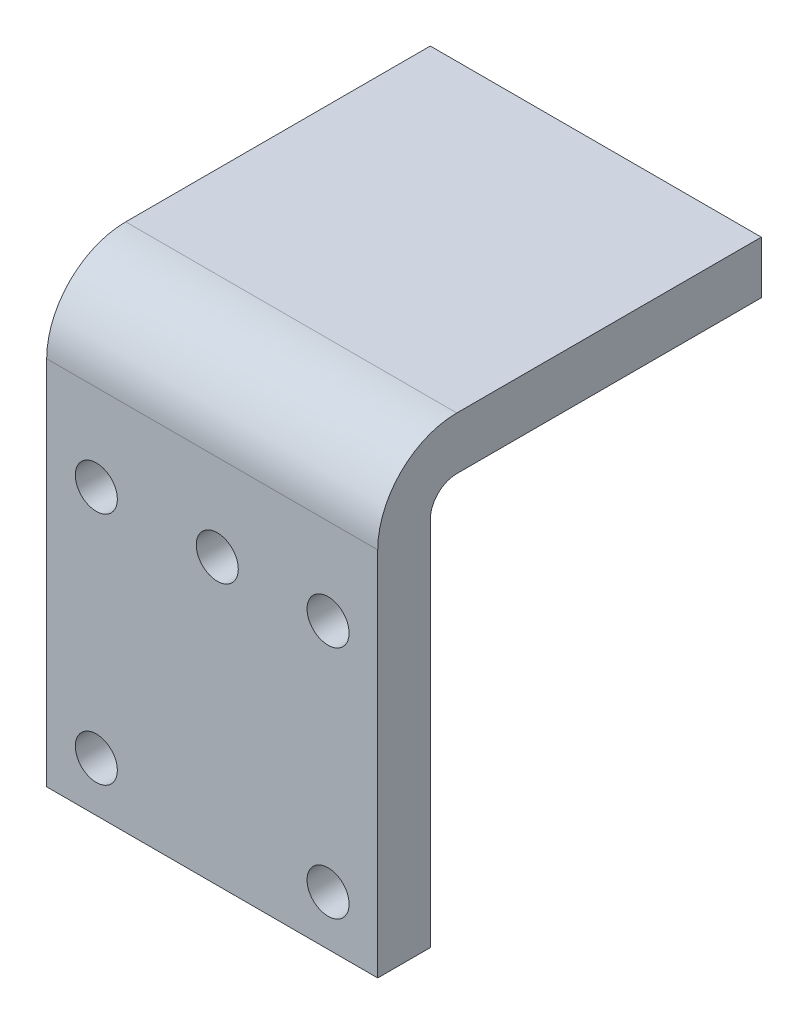
ISO-10303-21;
HEADER;
FILE_DESCRIPTION(('STEP AP214'),'2;1');
FILE_NAME('part.step','',(''),(''),'','','');
FILE_SCHEMA(('AUTOMOTIVE_DESIGN { 1 0 10303 214 1 1 1 1 }'));
ENDSEC;
DATA;
#1=APPLICATION_CONTEXT('core data for automotive mechanical design processes');
#2=APPLICATION_PROTOCOL_DEFINITION('international standard','automotive_design',2000,#1);
#3=PRODUCT_CONTEXT('',#1,'mechanical');
#4=PRODUCT('Part','Part','',(#3));
#5=PRODUCT_RELATED_PRODUCT_CATEGORY('part','',(#4));
#6=PRODUCT_DEFINITION_FORMATION('','',#4);
#7=PRODUCT_DEFINITION_CONTEXT('part definition',#1,'design');
#8=PRODUCT_DEFINITION('design','',#6,#7);
#9=PRODUCT_DEFINITION_SHAPE('','',#8);
#10=(LENGTH_UNIT() NAMED_UNIT(*) SI_UNIT(.MILLI.,.METRE.));
#11=(NAMED_UNIT(*) PLANE_ANGLE_UNIT() SI_UNIT($,.RADIAN.));
#12=(NAMED_UNIT(*) SI_UNIT($,.STERADIAN.) SOLID_ANGLE_UNIT());
#13=UNCERTAINTY_MEASURE_WITH_UNIT(LENGTH_MEASURE(1.E-05),#10,'distance_accuracy_value','');
#14=(GEOMETRIC_REPRESENTATION_CONTEXT(3) GLOBAL_UNCERTAINTY_ASSIGNED_CONTEXT((#13)) GLOBAL_UNIT_ASSIGNED_CONTEXT((#10,
#11,#12)) REPRESENTATION_CONTEXT('',''));
#15=CARTESIAN_POINT('',(0.,0.,0.));
#16=DIRECTION('',(0.,0.,1.));
#17=DIRECTION('',(1.,0.,0.));
#18=AXIS2_PLACEMENT_3D('',#15,#16,#17);
#19=CARTESIAN_POINT('',(100.,0.,-100.));
#20=DIRECTION('',(0.,0.,1.));
#21=DIRECTION('',(1.,0.,0.));
#22=AXIS2_PLACEMENT_3D('',#19,#20,#21);
#23=PLANE('',#22);
#24=DIRECTION('',(0.,1.,0.));
#25=VECTOR('',#24,1.);
#26=CARTESIAN_POINT('',(0.,0.,-100.));
#27=LINE('',#26,#25);
#28=CARTESIAN_POINT('',(0.,0.,-100.));
#29=VERTEX_POINT('',#28);
#30=CARTESIAN_POINT('',(0.,15.875,-100.));
#31=VERTEX_POINT('',#30);
#32=EDGE_CURVE('E132',#29,#31,#27,.T.);
#33=ORIENTED_EDGE('',*,*,#32,.T.);
#34=DIRECTION('',(-1.,0.,0.));
#35=VECTOR('',#34,1.);
#36=CARTESIAN_POINT('',(100.,15.875,-100.));
#37=LINE('',#36,#35);
#38=CARTESIAN_POINT('',(100.,15.875,-100.));
#39=VERTEX_POINT('',#38);
#40=EDGE_CURVE('E11',#39,#31,#37,.T.);
#41=ORIENTED_EDGE('',*,*,#40,.F.);
#42=DIRECTION('',(0.,1.,0.));
#43=VECTOR('',#42,1.);
#44=CARTESIAN_POINT('',(100.,0.,-100.));
#45=LINE('',#44,#43);
#46=CARTESIAN_POINT('',(100.,0.,-100.));
#47=VERTEX_POINT('',#46);
#48=EDGE_CURVE('E147',#47,#39,#45,.T.);
#49=ORIENTED_EDGE('',*,*,#48,.F.);
#50=DIRECTION('',(-1.,0.,0.));
#51=VECTOR('',#50,1.);
#52=CARTESIAN_POINT('',(100.,0.,-100.));
#53=LINE('',#52,#51);
#54=EDGE_CURVE('E128',#47,#29,#53,.T.);
#55=ORIENTED_EDGE('',*,*,#54,.T.);
#56=EDGE_LOOP('',(#33,#41,#49,#55));
#57=FACE_BOUND('',#56,.T.);
#58=ADVANCED_FACE('F34',(#57),#23,.F.);
#59=CARTESIAN_POINT('',(100.,15.875,-8.));
#60=DIRECTION('',(0.,-1.,0.));
#61=DIRECTION('',(0.,0.,-1.));
#62=AXIS2_PLACEMENT_3D('',#59,#60,#61);
#63=PLANE('',#62);
#64=DIRECTION('',(0.,0.,1.));
#65=VECTOR('',#64,1.);
#66=CARTESIAN_POINT('',(0.,15.875,-8.));
#67=LINE('',#66,#65);
#68=CARTESIAN_POINT('',(0.,15.875,-8.));
#69=VERTEX_POINT('',#68);
#70=EDGE_CURVE('E135',#31,#69,#67,.T.);
#71=ORIENTED_EDGE('',*,*,#70,.T.);
#72=DIRECTION('',(-1.,0.,0.));
#73=VECTOR('',#72,1.);
#74=CARTESIAN_POINT('',(100.,15.875,-8.));
#75=LINE('',#74,#73);
#76=CARTESIAN_POINT('',(100.,15.875,-8.));
#77=VERTEX_POINT('',#76);
#78=EDGE_CURVE('E43',#77,#69,#75,.T.);
#79=ORIENTED_EDGE('',*,*,#78,.F.);
#80=DIRECTION('',(0.,0.,1.));
#81=VECTOR('',#80,1.);
#82=CARTESIAN_POINT('',(100.,15.875,-8.));
#83=LINE('',#82,#81);
#84=EDGE_CURVE('E95',#39,#77,#83,.T.);
#85=ORIENTED_EDGE('',*,*,#84,.F.);
#86=ORIENTED_EDGE('',*,*,#40,.T.);
#87=EDGE_LOOP('',(#71,#79,#85,#86));
#88=FACE_BOUND('',#87,.T.);
#89=ADVANCED_FACE('F216',(#88),#63,.F.);
#90=CARTESIAN_POINT('',(100.,-8.,-8.));
#91=DIRECTION('',(-1.,0.,0.));
#92=DIRECTION('',(0.,0.,1.));
#93=AXIS2_PLACEMENT_3D('',#90,#91,#92);
#94=CYLINDRICAL_SURFACE('',#93,23.875);
#95=CARTESIAN_POINT('',(0.,-8.,-8.));
#96=DIRECTION('',(1.,0.,0.));
#97=DIRECTION('',(0.,0.,-1.));
#98=AXIS2_PLACEMENT_3D('',#95,#96,#97);
#99=CIRCLE('',#98,23.875);
#100=CARTESIAN_POINT('',(0.,-8.,15.875));
#101=VERTEX_POINT('',#100);
#102=EDGE_CURVE('E138',#69,#101,#99,.T.);
#103=ORIENTED_EDGE('',*,*,#102,.T.);
#104=DIRECTION('',(-1.,0.,0.));
#105=VECTOR('',#104,1.);
#106=CARTESIAN_POINT('',(100.,-8.,15.875));
#107=LINE('',#106,#105);
#108=CARTESIAN_POINT('',(100.,-8.,15.875));
#109=VERTEX_POINT('',#108);
#110=EDGE_CURVE('E154',#109,#101,#107,.T.);
#111=ORIENTED_EDGE('',*,*,#110,.F.);
#112=CARTESIAN_POINT('',(100.,-8.,-8.));
#113=DIRECTION('',(1.,0.,0.));
#114=DIRECTION('',(0.,0.,-1.));
#115=AXIS2_PLACEMENT_3D('',#112,#113,#114);
#116=CIRCLE('',#115,23.875);
#117=EDGE_CURVE('E185',#77,#109,#116,.T.);
#118=ORIENTED_EDGE('',*,*,#117,.F.);
#119=ORIENTED_EDGE('',*,*,#78,.T.);
#120=EDGE_LOOP('',(#103,#111,#118,#119));
#121=FACE_BOUND('',#120,.T.);
#122=ADVANCED_FACE('F220',(#121),#94,.T.);
#123=CARTESIAN_POINT('',(100.,-8.,15.875));
#124=DIRECTION('',(0.,0.,-1.));
#125=DIRECTION('',(-1.,0.,0.));
#126=AXIS2_PLACEMENT_3D('',#123,#124,#125);
#127=PLANE('',#126);
#128=CARTESIAN_POINT('',(51.5321893870748,-34.0898949094365,15.875));
#129=DIRECTION('',(0.,0.,1.));
#130=DIRECTION('',(1.,0.,0.));
#131=AXIS2_PLACEMENT_3D('',#128,#129,#130);
#132=CIRCLE('',#131,6.35000000000001);
#133=CARTESIAN_POINT('',(57.8821893870748,-34.0898949094365,15.875));
#134=VERTEX_POINT('',#133);
#135=EDGE_CURVE('E271',#134,#134,#132,.T.);
#136=ORIENTED_EDGE('',*,*,#135,.F.);
#137=EDGE_LOOP('',(#136));
#138=FACE_BOUND('',#137,.T.);
#139=CARTESIAN_POINT('',(85.,-105.,15.875));
#140=DIRECTION('',(0.,0.,1.));
#141=DIRECTION('',(1.,0.,0.));
#142=AXIS2_PLACEMENT_3D('',#139,#140,#141);
#143=CIRCLE('',#142,6.34999999999999);
#144=CARTESIAN_POINT('',(91.35,-105.,15.875));
#145=VERTEX_POINT('',#144);
#146=EDGE_CURVE('E269',#145,#145,#143,.T.);
#147=ORIENTED_EDGE('',*,*,#146,.F.);
#148=EDGE_LOOP('',(#147));
#149=FACE_BOUND('',#148,.T.);
#150=CARTESIAN_POINT('',(15.,-105.,15.875));
#151=DIRECTION('',(0.,0.,1.));
#152=DIRECTION('',(1.,0.,0.));
#153=AXIS2_PLACEMENT_3D('',#150,#151,#152);
#154=CIRCLE('',#153,6.35);
#155=CARTESIAN_POINT('',(21.35,-105.,15.875));
#156=VERTEX_POINT('',#155);
#157=EDGE_CURVE('E181',#156,#156,#154,.T.);
#158=ORIENTED_EDGE('',*,*,#157,.F.);
#159=EDGE_LOOP('',(#158));
#160=FACE_BOUND('',#159,.T.);
#161=CARTESIAN_POINT('',(85.,-34.0898949094365,15.875));
#162=DIRECTION('',(0.,0.,1.));
#163=DIRECTION('',(1.,0.,0.));
#164=AXIS2_PLACEMENT_3D('',#161,#162,#163);
#165=CIRCLE('',#164,6.35);
#166=CARTESIAN_POINT('',(91.35,-34.0898949094365,15.875));
#167=VERTEX_POINT('',#166);
#168=EDGE_CURVE('E166',#167,#167,#165,.T.);
#169=ORIENTED_EDGE('',*,*,#168,.F.);
#170=EDGE_LOOP('',(#169));
#171=FACE_BOUND('',#170,.T.);
#172=CARTESIAN_POINT('',(15.,-34.0898949094365,15.875));
#173=DIRECTION('',(0.,0.,1.));
#174=DIRECTION('',(1.,0.,0.));
#175=AXIS2_PLACEMENT_3D('',#172,#173,#174);
#176=CIRCLE('',#175,6.35);
#177=CARTESIAN_POINT('',(21.35,-34.0898949094365,15.875));
#178=VERTEX_POINT('',#177);
#179=EDGE_CURVE('E161',#178,#178,#176,.T.);
#180=ORIENTED_EDGE('',*,*,#179,.F.);
#181=EDGE_LOOP('',(#180));
#182=FACE_BOUND('',#181,.T.);
#183=DIRECTION('',(0.,-1.,0.));
#184=VECTOR('',#183,1.);
#185=CARTESIAN_POINT('',(0.,-8.,15.875));
#186=LINE('',#185,#184);
#187=CARTESIAN_POINT('',(0.,-120.,15.875));
#188=VERTEX_POINT('',#187);
#189=EDGE_CURVE('E140',#101,#188,#186,.T.);
#190=ORIENTED_EDGE('',*,*,#189,.T.);
#191=DIRECTION('',(-1.,0.,0.));
#192=VECTOR('',#191,1.);
#193=CARTESIAN_POINT('',(100.,-120.,15.875));
#194=LINE('',#193,#192);
#195=CARTESIAN_POINT('',(100.,-120.,15.875));
#196=VERTEX_POINT('',#195);
#197=EDGE_CURVE('E151',#196,#188,#194,.T.);
#198=ORIENTED_EDGE('',*,*,#197,.F.);
#199=DIRECTION('',(0.,-1.,0.));
#200=VECTOR('',#199,1.);
#201=CARTESIAN_POINT('',(100.,-8.,15.875));
#202=LINE('',#201,#200);
#203=EDGE_CURVE('E187',#109,#196,#202,.T.);
#204=ORIENTED_EDGE('',*,*,#203,.F.);
#205=ORIENTED_EDGE('',*,*,#110,.T.);
#206=EDGE_LOOP('',(#190,#198,#204,#205));
#207=FACE_BOUND('',#206,.T.);
#208=ADVANCED_FACE('F193',(#138,#149,#160,#171,#182,#207),#127,.F.);
#209=CARTESIAN_POINT('',(100.,-120.,0.));
#210=DIRECTION('',(0.,1.,0.));
#211=DIRECTION('',(0.,0.,1.));
#212=AXIS2_PLACEMENT_3D('',#209,#210,#211);
#213=PLANE('',#212);
#214=DIRECTION('',(0.,0.,-1.));
#215=VECTOR('',#214,1.);
#216=CARTESIAN_POINT('',(0.,-120.,0.));
#217=LINE('',#216,#215);
#218=CARTESIAN_POINT('',(0.,-120.,0.));
#219=VERTEX_POINT('',#218);
#220=EDGE_CURVE('E142',#188,#219,#217,.T.);
#221=ORIENTED_EDGE('',*,*,#220,.T.);
#222=DIRECTION('',(-1.,0.,0.));
#223=VECTOR('',#222,1.);
#224=CARTESIAN_POINT('',(100.,-120.,0.));
#225=LINE('',#224,#223);
#226=CARTESIAN_POINT('',(100.,-120.,0.));
#227=VERTEX_POINT('',#226);
#228=EDGE_CURVE('E123',#227,#219,#225,.T.);
#229=ORIENTED_EDGE('',*,*,#228,.F.);
#230=DIRECTION('',(0.,0.,-1.));
#231=VECTOR('',#230,1.);
#232=CARTESIAN_POINT('',(100.,-120.,0.));
#233=LINE('',#232,#231);
#234=EDGE_CURVE('E114',#196,#227,#233,.T.);
#235=ORIENTED_EDGE('',*,*,#234,.F.);
#236=ORIENTED_EDGE('',*,*,#197,.T.);
#237=EDGE_LOOP('',(#221,#229,#235,#236));
#238=FACE_BOUND('',#237,.T.);
#239=ADVANCED_FACE('F197',(#238),#213,.F.);
#240=CARTESIAN_POINT('',(100.,-8.,0.));
#241=DIRECTION('',(0.,0.,1.));
#242=DIRECTION('',(0.,-1.,0.));
#243=AXIS2_PLACEMENT_3D('',#240,#241,#242);
#244=PLANE('',#243);
#245=CARTESIAN_POINT('',(51.5321893870748,-34.0898949094365,0.));
#246=DIRECTION('',(0.,0.,1.));
#247=DIRECTION('',(0.,-1.,0.));
#248=AXIS2_PLACEMENT_3D('',#245,#246,#247);
#249=CIRCLE('',#248,6.35000000000001);
#250=CARTESIAN_POINT('',(51.5321893870748,-40.4398949094365,0.));
#251=VERTEX_POINT('',#250);
#252=EDGE_CURVE('E37',#251,#251,#249,.T.);
#253=ORIENTED_EDGE('',*,*,#252,.T.);
#254=EDGE_LOOP('',(#253));
#255=FACE_BOUND('',#254,.T.);
#256=CARTESIAN_POINT('',(85.,-105.,0.));
#257=DIRECTION('',(0.,0.,1.));
#258=DIRECTION('',(0.,-1.,0.));
#259=AXIS2_PLACEMENT_3D('',#256,#257,#258);
#260=CIRCLE('',#259,6.34999999999999);
#261=CARTESIAN_POINT('',(85.,-111.35,0.));
#262=VERTEX_POINT('',#261);
#263=EDGE_CURVE('E168',#262,#262,#260,.T.);
#264=ORIENTED_EDGE('',*,*,#263,.T.);
#265=EDGE_LOOP('',(#264));
#266=FACE_BOUND('',#265,.T.);
#267=CARTESIAN_POINT('',(15.,-105.,0.));
#268=DIRECTION('',(0.,0.,1.));
#269=DIRECTION('',(0.,-1.,0.));
#270=AXIS2_PLACEMENT_3D('',#267,#268,#269);
#271=CIRCLE('',#270,6.35);
#272=CARTESIAN_POINT('',(15.,-111.35,0.));
#273=VERTEX_POINT('',#272);
#274=EDGE_CURVE('E165',#273,#273,#271,.T.);
#275=ORIENTED_EDGE('',*,*,#274,.T.);
#276=EDGE_LOOP('',(#275));
#277=FACE_BOUND('',#276,.T.);
#278=CARTESIAN_POINT('',(85.,-34.0898949094365,0.));
#279=DIRECTION('',(0.,0.,1.));
#280=DIRECTION('',(0.,-1.,0.));
#281=AXIS2_PLACEMENT_3D('',#278,#279,#280);
#282=CIRCLE('',#281,6.35);
#283=CARTESIAN_POINT('',(85.,-40.4398949094365,0.));
#284=VERTEX_POINT('',#283);
#285=EDGE_CURVE('E162',#284,#284,#282,.T.);
#286=ORIENTED_EDGE('',*,*,#285,.T.);
#287=EDGE_LOOP('',(#286));
#288=FACE_BOUND('',#287,.T.);
#289=CARTESIAN_POINT('',(15.,-34.0898949094365,0.));
#290=DIRECTION('',(0.,0.,1.));
#291=DIRECTION('',(0.,-1.,0.));
#292=AXIS2_PLACEMENT_3D('',#289,#290,#291);
#293=CIRCLE('',#292,6.35);
#294=CARTESIAN_POINT('',(15.,-40.4398949094365,0.));
#295=VERTEX_POINT('',#294);
#296=EDGE_CURVE('E136',#295,#295,#293,.T.);
#297=ORIENTED_EDGE('',*,*,#296,.T.);
#298=EDGE_LOOP('',(#297));
#299=FACE_BOUND('',#298,.T.);
#300=DIRECTION('',(0.,1.,0.));
#301=VECTOR('',#300,1.);
#302=CARTESIAN_POINT('',(0.,-8.,0.));
#303=LINE('',#302,#301);
#304=CARTESIAN_POINT('',(0.,-8.,0.));
#305=VERTEX_POINT('',#304);
#306=EDGE_CURVE('E122',#219,#305,#303,.T.);
#307=ORIENTED_EDGE('',*,*,#306,.T.);
#308=DIRECTION('',(-1.,0.,0.));
#309=VECTOR('',#308,1.);
#310=CARTESIAN_POINT('',(100.,-8.,0.));
#311=LINE('',#310,#309);
#312=CARTESIAN_POINT('',(100.,-8.,0.));
#313=VERTEX_POINT('',#312);
#314=EDGE_CURVE('E119',#313,#305,#311,.T.);
#315=ORIENTED_EDGE('',*,*,#314,.F.);
#316=DIRECTION('',(0.,1.,0.));
#317=VECTOR('',#316,1.);
#318=CARTESIAN_POINT('',(100.,-8.,0.));
#319=LINE('',#318,#317);
#320=EDGE_CURVE('E108',#227,#313,#319,.T.);
#321=ORIENTED_EDGE('',*,*,#320,.F.);
#322=ORIENTED_EDGE('',*,*,#228,.T.);
#323=EDGE_LOOP('',(#307,#315,#321,#322));
#324=FACE_BOUND('',#323,.T.);
#325=ADVANCED_FACE('F120',(#255,#266,#277,#288,#299,#324),#244,.F.);
#326=CARTESIAN_POINT('',(100.,-8.,-8.));
#327=DIRECTION('',(-1.,0.,0.));
#328=DIRECTION('',(0.,0.,1.));
#329=AXIS2_PLACEMENT_3D('',#326,#327,#328);
#330=CYLINDRICAL_SURFACE('',#329,8.);
#331=CARTESIAN_POINT('',(0.,-8.,-8.));
#332=DIRECTION('',(-1.,0.,0.));
#333=DIRECTION('',(0.,0.,-1.));
#334=AXIS2_PLACEMENT_3D('',#331,#332,#333);
#335=CIRCLE('',#334,8.);
#336=CARTESIAN_POINT('',(0.,0.,-8.));
#337=VERTEX_POINT('',#336);
#338=EDGE_CURVE('E81',#305,#337,#335,.T.);
#339=ORIENTED_EDGE('',*,*,#338,.T.);
#340=DIRECTION('',(-1.,0.,0.));
#341=VECTOR('',#340,1.);
#342=CARTESIAN_POINT('',(100.,0.,-8.));
#343=LINE('',#342,#341);
#344=CARTESIAN_POINT('',(100.,0.,-8.));
#345=VERTEX_POINT('',#344);
#346=EDGE_CURVE('E124',#345,#337,#343,.T.);
#347=ORIENTED_EDGE('',*,*,#346,.F.);
#348=CARTESIAN_POINT('',(100.,-8.,-8.));
#349=DIRECTION('',(-1.,0.,0.));
#350=DIRECTION('',(0.,0.,-1.));
#351=AXIS2_PLACEMENT_3D('',#348,#349,#350);
#352=CIRCLE('',#351,8.);
#353=EDGE_CURVE('E112',#313,#345,#352,.T.);
#354=ORIENTED_EDGE('',*,*,#353,.F.);
#355=ORIENTED_EDGE('',*,*,#314,.T.);
#356=EDGE_LOOP('',(#339,#347,#354,#355));
#357=FACE_BOUND('',#356,.T.);
#358=ADVANCED_FACE('F126',(#357),#330,.F.);
#359=CARTESIAN_POINT('',(100.,0.,-8.));
#360=DIRECTION('',(0.,1.,0.));
#361=DIRECTION('',(0.,0.,1.));
#362=AXIS2_PLACEMENT_3D('',#359,#360,#361);
#363=PLANE('',#362);
#364=DIRECTION('',(0.,0.,-1.));
#365=VECTOR('',#364,1.);
#366=CARTESIAN_POINT('',(0.,0.,-8.));
#367=LINE('',#366,#365);
#368=EDGE_CURVE('E87',#337,#29,#367,.T.);
#369=ORIENTED_EDGE('',*,*,#368,.T.);
#370=ORIENTED_EDGE('',*,*,#54,.F.);
#371=DIRECTION('',(0.,0.,-1.));
#372=VECTOR('',#371,1.);
#373=CARTESIAN_POINT('',(100.,0.,-8.));
#374=LINE('',#373,#372);
#375=EDGE_CURVE('E52',#345,#47,#374,.T.);
#376=ORIENTED_EDGE('',*,*,#375,.F.);
#377=ORIENTED_EDGE('',*,*,#346,.T.);
#378=EDGE_LOOP('',(#369,#370,#376,#377));
#379=FACE_BOUND('',#378,.T.);
#380=ADVANCED_FACE('F205',(#379),#363,.F.);
#381=CARTESIAN_POINT('',(100.,-8.,-8.));
#382=DIRECTION('',(1.,0.,0.));
#383=DIRECTION('',(0.,0.,-1.));
#384=AXIS2_PLACEMENT_3D('',#381,#382,#383);
#385=PLANE('',#384);
#386=ORIENTED_EDGE('',*,*,#48,.T.);
#387=ORIENTED_EDGE('',*,*,#84,.T.);
#388=ORIENTED_EDGE('',*,*,#117,.T.);
#389=ORIENTED_EDGE('',*,*,#203,.T.);
#390=ORIENTED_EDGE('',*,*,#234,.T.);
#391=ORIENTED_EDGE('',*,*,#320,.T.);
#392=ORIENTED_EDGE('',*,*,#353,.T.);
#393=ORIENTED_EDGE('',*,*,#375,.T.);
#394=EDGE_LOOP('',(#386,#387,#388,#389,#390,#391,#392,#393));
#395=FACE_BOUND('',#394,.T.);
#396=ADVANCED_FACE('F110',(#395),#385,.T.);
#397=CARTESIAN_POINT('',(0.,-8.,-8.));
#398=DIRECTION('',(1.,0.,0.));
#399=DIRECTION('',(0.,0.,-1.));
#400=AXIS2_PLACEMENT_3D('',#397,#398,#399);
#401=PLANE('',#400);
#402=ORIENTED_EDGE('',*,*,#32,.F.);
#403=ORIENTED_EDGE('',*,*,#368,.F.);
#404=ORIENTED_EDGE('',*,*,#338,.F.);
#405=ORIENTED_EDGE('',*,*,#306,.F.);
#406=ORIENTED_EDGE('',*,*,#220,.F.);
#407=ORIENTED_EDGE('',*,*,#189,.F.);
#408=ORIENTED_EDGE('',*,*,#102,.F.);
#409=ORIENTED_EDGE('',*,*,#70,.F.);
#410=EDGE_LOOP('',(#402,#403,#404,#405,#406,#407,#408,#409));
#411=FACE_BOUND('',#410,.T.);
#412=ADVANCED_FACE('F200',(#411),#401,.F.);
#413=CARTESIAN_POINT('',(15.,-34.0898949094365,-84.125));
#414=DIRECTION('',(0.,0.,1.));
#415=DIRECTION('',(1.,0.,0.));
#416=AXIS2_PLACEMENT_3D('',#413,#414,#415);
#417=CYLINDRICAL_SURFACE('',#416,6.35);
#418=ORIENTED_EDGE('',*,*,#179,.T.);
#419=EDGE_LOOP('',(#418));
#420=FACE_BOUND('',#419,.T.);
#421=ORIENTED_EDGE('',*,*,#296,.F.);
#422=EDGE_LOOP('',(#421));
#423=FACE_BOUND('',#422,.T.);
#424=ADVANCED_FACE('F242',(#420,#423),#417,.F.);
#425=CARTESIAN_POINT('',(85.,-34.0898949094365,-84.125));
#426=DIRECTION('',(0.,0.,1.));
#427=DIRECTION('',(1.,0.,0.));
#428=AXIS2_PLACEMENT_3D('',#425,#426,#427);
#429=CYLINDRICAL_SURFACE('',#428,6.35);
#430=ORIENTED_EDGE('',*,*,#168,.T.);
#431=EDGE_LOOP('',(#430));
#432=FACE_BOUND('',#431,.T.);
#433=ORIENTED_EDGE('',*,*,#285,.F.);
#434=EDGE_LOOP('',(#433));
#435=FACE_BOUND('',#434,.T.);
#436=ADVANCED_FACE('F244',(#432,#435),#429,.F.);
#437=CARTESIAN_POINT('',(15.,-105.,-84.125));
#438=DIRECTION('',(0.,0.,1.));
#439=DIRECTION('',(1.,0.,0.));
#440=AXIS2_PLACEMENT_3D('',#437,#438,#439);
#441=CYLINDRICAL_SURFACE('',#440,6.35);
#442=ORIENTED_EDGE('',*,*,#157,.T.);
#443=EDGE_LOOP('',(#442));
#444=FACE_BOUND('',#443,.T.);
#445=ORIENTED_EDGE('',*,*,#274,.F.);
#446=EDGE_LOOP('',(#445));
#447=FACE_BOUND('',#446,.T.);
#448=ADVANCED_FACE('F250',(#444,#447),#441,.F.);
#449=CARTESIAN_POINT('',(85.,-105.,-84.125));
#450=DIRECTION('',(0.,0.,1.));
#451=DIRECTION('',(1.,0.,0.));
#452=AXIS2_PLACEMENT_3D('',#449,#450,#451);
#453=CYLINDRICAL_SURFACE('',#452,6.34999999999999);
#454=ORIENTED_EDGE('',*,*,#146,.T.);
#455=EDGE_LOOP('',(#454));
#456=FACE_BOUND('',#455,.T.);
#457=ORIENTED_EDGE('',*,*,#263,.F.);
#458=EDGE_LOOP('',(#457));
#459=FACE_BOUND('',#458,.T.);
#460=ADVANCED_FACE('F255',(#456,#459),#453,.F.);
#461=CARTESIAN_POINT('',(51.5321893870748,-34.0898949094365,-84.125));
#462=DIRECTION('',(0.,0.,1.));
#463=DIRECTION('',(1.,0.,0.));
#464=AXIS2_PLACEMENT_3D('',#461,#462,#463);
#465=CYLINDRICAL_SURFACE('',#464,6.35000000000001);
#466=ORIENTED_EDGE('',*,*,#135,.T.);
#467=EDGE_LOOP('',(#466));
#468=FACE_BOUND('',#467,.T.);
#469=ORIENTED_EDGE('',*,*,#252,.F.);
#470=EDGE_LOOP('',(#469));
#471=FACE_BOUND('',#470,.T.);
#472=ADVANCED_FACE('F258',(#468,#471),#465,.F.);
#473=CLOSED_SHELL('',(#58,#89,#122,#208,#239,#325,#358,#380,#396,#412,#424,#436,#448,#460,#472));
#474=MANIFOLD_SOLID_BREP('B2',#473);
#475=ADVANCED_BREP_SHAPE_REPRESENTATION('',(#18,#474),#14);
#476=SHAPE_DEFINITION_REPRESENTATION(#9,#475);
ENDSEC;
END-ISO-10303-21;
